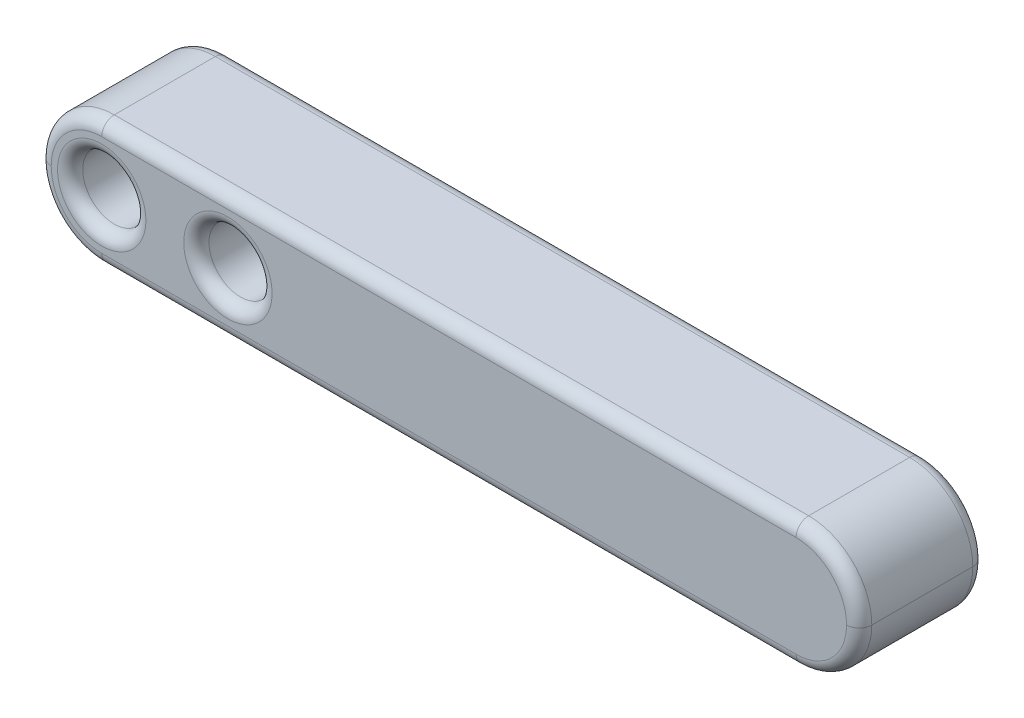
ISO-10303-21;
HEADER;
FILE_DESCRIPTION(('STEP AP214'),'2;1');
FILE_NAME('part.step','',(''),(''),'','','');
FILE_SCHEMA(('AUTOMOTIVE_DESIGN { 1 0 10303 214 1 1 1 1 }'));
ENDSEC;
DATA;
#1=APPLICATION_CONTEXT('core data for automotive mechanical design processes');
#2=APPLICATION_PROTOCOL_DEFINITION('international standard','automotive_design',2000,#1);
#3=PRODUCT_CONTEXT('',#1,'mechanical');
#4=PRODUCT('Part','Part','',(#3));
#5=PRODUCT_RELATED_PRODUCT_CATEGORY('part','',(#4));
#6=PRODUCT_DEFINITION_FORMATION('','',#4);
#7=PRODUCT_DEFINITION_CONTEXT('part definition',#1,'design');
#8=PRODUCT_DEFINITION('design','',#6,#7);
#9=PRODUCT_DEFINITION_SHAPE('','',#8);
#10=(LENGTH_UNIT() NAMED_UNIT(*) SI_UNIT(.MILLI.,.METRE.));
#11=(NAMED_UNIT(*) PLANE_ANGLE_UNIT() SI_UNIT($,.RADIAN.));
#12=(NAMED_UNIT(*) SI_UNIT($,.STERADIAN.) SOLID_ANGLE_UNIT());
#13=UNCERTAINTY_MEASURE_WITH_UNIT(LENGTH_MEASURE(1.E-05),#10,'distance_accuracy_value','');
#14=(GEOMETRIC_REPRESENTATION_CONTEXT(3) GLOBAL_UNCERTAINTY_ASSIGNED_CONTEXT((#13)) GLOBAL_UNIT_ASSIGNED_CONTEXT((#10,
#11,#12)) REPRESENTATION_CONTEXT('',''));
#15=CARTESIAN_POINT('',(0.,0.,0.));
#16=DIRECTION('',(0.,0.,1.));
#17=DIRECTION('',(1.,0.,0.));
#18=AXIS2_PLACEMENT_3D('',#15,#16,#17);
#19=CARTESIAN_POINT('',(0.,0.,10.));
#20=DIRECTION('',(0.,0.,-1.));
#21=DIRECTION('',(-1.,0.,0.));
#22=AXIS2_PLACEMENT_3D('',#19,#20,#21);
#23=PLANE('',#22);
#24=CARTESIAN_POINT('',(-17.5,0.,10.));
#25=DIRECTION('',(0.,0.,-1.));
#26=DIRECTION('',(-1.,0.,0.));
#27=AXIS2_PLACEMENT_3D('',#24,#25,#26);
#28=CIRCLE('',#27,3.5);
#29=CARTESIAN_POINT('',(-21.,0.,10.));
#30=VERTEX_POINT('',#29);
#31=EDGE_CURVE('E200',#30,#30,#28,.T.);
#32=ORIENTED_EDGE('',*,*,#31,.T.);
#33=EDGE_LOOP('',(#32));
#34=FACE_BOUND('',#33,.T.);
#35=CARTESIAN_POINT('',(-27.5,0.,10.));
#36=DIRECTION('',(0.,0.,-1.));
#37=DIRECTION('',(-1.,0.,0.));
#38=AXIS2_PLACEMENT_3D('',#35,#36,#37);
#39=CIRCLE('',#38,3.5);
#40=CARTESIAN_POINT('',(-31.,0.,10.));
#41=VERTEX_POINT('',#40);
#42=EDGE_CURVE('E197',#41,#41,#39,.T.);
#43=ORIENTED_EDGE('',*,*,#42,.T.);
#44=EDGE_LOOP('',(#43));
#45=FACE_BOUND('',#44,.T.);
#46=CARTESIAN_POINT('',(-27.5,0.,10.));
#47=DIRECTION('',(0.,0.,-1.));
#48=DIRECTION('',(-1.,0.,0.));
#49=AXIS2_PLACEMENT_3D('',#46,#47,#48);
#50=CIRCLE('',#49,4.);
#51=CARTESIAN_POINT('',(-27.5,4.,10.));
#52=VERTEX_POINT('',#51);
#53=CARTESIAN_POINT('',(-31.5,0.,10.));
#54=VERTEX_POINT('',#53);
#55=EDGE_CURVE('E193',#52,#54,#50,.F.);
#56=ORIENTED_EDGE('',*,*,#55,.T.);
#57=CARTESIAN_POINT('',(-27.5,0.,10.));
#58=DIRECTION('',(0.,0.,-1.));
#59=DIRECTION('',(-1.,0.,0.));
#60=AXIS2_PLACEMENT_3D('',#57,#58,#59);
#61=CIRCLE('',#60,4.);
#62=CARTESIAN_POINT('',(-27.5,-4.,10.));
#63=VERTEX_POINT('',#62);
#64=EDGE_CURVE('E195',#54,#63,#61,.F.);
#65=ORIENTED_EDGE('',*,*,#64,.T.);
#66=DIRECTION('',(1.,0.,0.));
#67=VECTOR('',#66,1.);
#68=CARTESIAN_POINT('',(0.,-4.,10.));
#69=LINE('',#68,#67);
#70=CARTESIAN_POINT('',(27.5,-4.,10.));
#71=VERTEX_POINT('',#70);
#72=EDGE_CURVE('E188',#63,#71,#69,.T.);
#73=ORIENTED_EDGE('',*,*,#72,.T.);
#74=CARTESIAN_POINT('',(27.5,0.,10.));
#75=DIRECTION('',(0.,0.,-1.));
#76=DIRECTION('',(-1.,0.,0.));
#77=AXIS2_PLACEMENT_3D('',#74,#75,#76);
#78=CIRCLE('',#77,4.);
#79=CARTESIAN_POINT('',(31.5,0.,10.));
#80=VERTEX_POINT('',#79);
#81=EDGE_CURVE('E184',#71,#80,#78,.F.);
#82=ORIENTED_EDGE('',*,*,#81,.T.);
#83=CARTESIAN_POINT('',(27.5,0.,10.));
#84=DIRECTION('',(0.,0.,-1.));
#85=DIRECTION('',(-1.,0.,0.));
#86=AXIS2_PLACEMENT_3D('',#83,#84,#85);
#87=CIRCLE('',#86,4.);
#88=CARTESIAN_POINT('',(27.5,4.,10.));
#89=VERTEX_POINT('',#88);
#90=EDGE_CURVE('E186',#80,#89,#87,.F.);
#91=ORIENTED_EDGE('',*,*,#90,.T.);
#92=DIRECTION('',(-1.,0.,0.));
#93=VECTOR('',#92,1.);
#94=CARTESIAN_POINT('',(0.,4.,10.));
#95=LINE('',#94,#93);
#96=EDGE_CURVE('E190',#89,#52,#95,.T.);
#97=ORIENTED_EDGE('',*,*,#96,.T.);
#98=EDGE_LOOP('',(#56,#65,#73,#82,#91,#97));
#99=FACE_BOUND('',#98,.T.);
#100=ADVANCED_FACE('F38',(#34,#45,#99),#23,.F.);
#101=CARTESIAN_POINT('',(0.,0.,0.));
#102=DIRECTION('',(0.,0.,-1.));
#103=DIRECTION('',(-1.,0.,0.));
#104=AXIS2_PLACEMENT_3D('',#101,#102,#103);
#105=PLANE('',#104);
#106=CARTESIAN_POINT('',(-17.5,0.,0.));
#107=DIRECTION('',(0.,0.,-1.));
#108=DIRECTION('',(-1.,0.,0.));
#109=AXIS2_PLACEMENT_3D('',#106,#107,#108);
#110=CIRCLE('',#109,3.5);
#111=CARTESIAN_POINT('',(-21.,0.,0.));
#112=VERTEX_POINT('',#111);
#113=EDGE_CURVE('E167',#112,#112,#110,.F.);
#114=ORIENTED_EDGE('',*,*,#113,.T.);
#115=EDGE_LOOP('',(#114));
#116=FACE_BOUND('',#115,.T.);
#117=CARTESIAN_POINT('',(-27.5,0.,0.));
#118=DIRECTION('',(0.,0.,-1.));
#119=DIRECTION('',(-1.,0.,0.));
#120=AXIS2_PLACEMENT_3D('',#117,#118,#119);
#121=CIRCLE('',#120,3.5);
#122=CARTESIAN_POINT('',(-31.,0.,0.));
#123=VERTEX_POINT('',#122);
#124=EDGE_CURVE('E164',#123,#123,#121,.F.);
#125=ORIENTED_EDGE('',*,*,#124,.T.);
#126=EDGE_LOOP('',(#125));
#127=FACE_BOUND('',#126,.T.);
#128=CARTESIAN_POINT('',(-27.5,0.,0.));
#129=DIRECTION('',(0.,0.,-1.));
#130=DIRECTION('',(-1.,0.,0.));
#131=AXIS2_PLACEMENT_3D('',#128,#129,#130);
#132=CIRCLE('',#131,4.);
#133=CARTESIAN_POINT('',(-27.5,-4.,0.));
#134=VERTEX_POINT('',#133);
#135=CARTESIAN_POINT('',(-31.5,0.,0.));
#136=VERTEX_POINT('',#135);
#137=EDGE_CURVE('E156',#134,#136,#132,.T.);
#138=ORIENTED_EDGE('',*,*,#137,.T.);
#139=CARTESIAN_POINT('',(-27.5,0.,0.));
#140=DIRECTION('',(0.,0.,-1.));
#141=DIRECTION('',(-1.,0.,0.));
#142=AXIS2_PLACEMENT_3D('',#139,#140,#141);
#143=CIRCLE('',#142,4.);
#144=CARTESIAN_POINT('',(-27.5,4.,0.));
#145=VERTEX_POINT('',#144);
#146=EDGE_CURVE('E162',#136,#145,#143,.T.);
#147=ORIENTED_EDGE('',*,*,#146,.T.);
#148=DIRECTION('',(-1.,0.,0.));
#149=VECTOR('',#148,1.);
#150=CARTESIAN_POINT('',(27.5,4.,0.));
#151=LINE('',#150,#149);
#152=CARTESIAN_POINT('',(27.5,4.,0.));
#153=VERTEX_POINT('',#152);
#154=EDGE_CURVE('E154',#145,#153,#151,.F.);
#155=ORIENTED_EDGE('',*,*,#154,.T.);
#156=CARTESIAN_POINT('',(27.5,0.,0.));
#157=DIRECTION('',(0.,0.,-1.));
#158=DIRECTION('',(-1.,0.,0.));
#159=AXIS2_PLACEMENT_3D('',#156,#157,#158);
#160=CIRCLE('',#159,4.);
#161=CARTESIAN_POINT('',(31.5,0.,0.));
#162=VERTEX_POINT('',#161);
#163=EDGE_CURVE('E135',#153,#162,#160,.T.);
#164=ORIENTED_EDGE('',*,*,#163,.T.);
#165=CARTESIAN_POINT('',(27.5,0.,0.));
#166=DIRECTION('',(0.,0.,-1.));
#167=DIRECTION('',(-1.,0.,0.));
#168=AXIS2_PLACEMENT_3D('',#165,#166,#167);
#169=CIRCLE('',#168,4.);
#170=CARTESIAN_POINT('',(27.5,-4.,0.));
#171=VERTEX_POINT('',#170);
#172=EDGE_CURVE('E143',#162,#171,#169,.T.);
#173=ORIENTED_EDGE('',*,*,#172,.T.);
#174=DIRECTION('',(1.,0.,0.));
#175=VECTOR('',#174,1.);
#176=CARTESIAN_POINT('',(-27.5,-4.,0.));
#177=LINE('',#176,#175);
#178=EDGE_CURVE('E149',#171,#134,#177,.F.);
#179=ORIENTED_EDGE('',*,*,#178,.T.);
#180=EDGE_LOOP('',(#138,#147,#155,#164,#173,#179));
#181=FACE_BOUND('',#180,.T.);
#182=ADVANCED_FACE('F152',(#116,#127,#181),#105,.T.);
#183=CARTESIAN_POINT('',(-32.5,5.,10.));
#184=DIRECTION('',(0.,-1.,0.));
#185=DIRECTION('',(0.,0.,-1.));
#186=AXIS2_PLACEMENT_3D('',#183,#184,#185);
#187=PLANE('',#186);
#188=DIRECTION('',(0.,0.,-1.));
#189=VECTOR('',#188,1.);
#190=CARTESIAN_POINT('',(27.5,5.,10.));
#191=LINE('',#190,#189);
#192=CARTESIAN_POINT('',(27.5,5.,9.));
#193=VERTEX_POINT('',#192);
#194=CARTESIAN_POINT('',(27.5,5.,0.999999999999999));
#195=VERTEX_POINT('',#194);
#196=EDGE_CURVE('E150',#193,#195,#191,.T.);
#197=ORIENTED_EDGE('',*,*,#196,.T.);
#198=DIRECTION('',(-1.,0.,0.));
#199=VECTOR('',#198,1.);
#200=CARTESIAN_POINT('',(-27.5,5.,0.999999999999999));
#201=LINE('',#200,#199);
#202=CARTESIAN_POINT('',(-27.5,5.,0.999999999999999));
#203=VERTEX_POINT('',#202);
#204=EDGE_CURVE('E176',#195,#203,#201,.T.);
#205=ORIENTED_EDGE('',*,*,#204,.T.);
#206=DIRECTION('',(0.,0.,-1.));
#207=VECTOR('',#206,1.);
#208=CARTESIAN_POINT('',(-27.5,5.,10.));
#209=LINE('',#208,#207);
#210=CARTESIAN_POINT('',(-27.5,5.,9.));
#211=VERTEX_POINT('',#210);
#212=EDGE_CURVE('E268',#203,#211,#209,.F.);
#213=ORIENTED_EDGE('',*,*,#212,.T.);
#214=DIRECTION('',(-1.,0.,0.));
#215=VECTOR('',#214,1.);
#216=CARTESIAN_POINT('',(-32.5,5.,9.));
#217=LINE('',#216,#215);
#218=EDGE_CURVE('E173',#211,#193,#217,.F.);
#219=ORIENTED_EDGE('',*,*,#218,.T.);
#220=EDGE_LOOP('',(#197,#205,#213,#219));
#221=FACE_BOUND('',#220,.T.);
#222=ADVANCED_FACE('F293',(#221),#187,.F.);
#223=CARTESIAN_POINT('',(-32.5,-5.,10.));
#224=DIRECTION('',(0.,1.,0.));
#225=DIRECTION('',(0.,0.,1.));
#226=AXIS2_PLACEMENT_3D('',#223,#224,#225);
#227=PLANE('',#226);
#228=DIRECTION('',(0.,0.,-1.));
#229=VECTOR('',#228,1.);
#230=CARTESIAN_POINT('',(-27.5,-5.,10.));
#231=LINE('',#230,#229);
#232=CARTESIAN_POINT('',(-27.5,-5.,9.));
#233=VERTEX_POINT('',#232);
#234=CARTESIAN_POINT('',(-27.5,-5.,0.999999999999999));
#235=VERTEX_POINT('',#234);
#236=EDGE_CURVE('E260',#233,#235,#231,.T.);
#237=ORIENTED_EDGE('',*,*,#236,.T.);
#238=DIRECTION('',(1.,0.,0.));
#239=VECTOR('',#238,1.);
#240=CARTESIAN_POINT('',(27.5,-5.,0.999999999999999));
#241=LINE('',#240,#239);
#242=CARTESIAN_POINT('',(27.5,-5.,0.999999999999999));
#243=VERTEX_POINT('',#242);
#244=EDGE_CURVE('E211',#235,#243,#241,.T.);
#245=ORIENTED_EDGE('',*,*,#244,.T.);
#246=DIRECTION('',(0.,0.,-1.));
#247=VECTOR('',#246,1.);
#248=CARTESIAN_POINT('',(27.5,-5.,10.));
#249=LINE('',#248,#247);
#250=CARTESIAN_POINT('',(27.5,-5.,9.));
#251=VERTEX_POINT('',#250);
#252=EDGE_CURVE('E263',#243,#251,#249,.F.);
#253=ORIENTED_EDGE('',*,*,#252,.T.);
#254=DIRECTION('',(1.,0.,0.));
#255=VECTOR('',#254,1.);
#256=CARTESIAN_POINT('',(-32.5,-5.,9.));
#257=LINE('',#256,#255);
#258=EDGE_CURVE('E209',#251,#233,#257,.F.);
#259=ORIENTED_EDGE('',*,*,#258,.T.);
#260=EDGE_LOOP('',(#237,#245,#253,#259));
#261=FACE_BOUND('',#260,.T.);
#262=ADVANCED_FACE('F259',(#261),#227,.F.);
#263=CARTESIAN_POINT('',(-27.5,0.,10.));
#264=DIRECTION('',(0.,0.,-1.));
#265=DIRECTION('',(-1.,0.,0.));
#266=AXIS2_PLACEMENT_3D('',#263,#264,#265);
#267=CYLINDRICAL_SURFACE('',#266,2.5);
#268=CARTESIAN_POINT('',(-27.5,0.,0.999999999999999));
#269=DIRECTION('',(0.,0.,-1.));
#270=DIRECTION('',(-1.,0.,0.));
#271=AXIS2_PLACEMENT_3D('',#268,#269,#270);
#272=CIRCLE('',#271,2.5);
#273=CARTESIAN_POINT('',(-30.,0.,0.999999999999999));
#274=VERTEX_POINT('',#273);
#275=EDGE_CURVE('E206',#274,#274,#272,.T.);
#276=ORIENTED_EDGE('',*,*,#275,.T.);
#277=EDGE_LOOP('',(#276));
#278=FACE_BOUND('',#277,.T.);
#279=CARTESIAN_POINT('',(-27.5,0.,9.));
#280=DIRECTION('',(0.,0.,-1.));
#281=DIRECTION('',(-1.,0.,0.));
#282=AXIS2_PLACEMENT_3D('',#279,#280,#281);
#283=CIRCLE('',#282,2.5);
#284=CARTESIAN_POINT('',(-30.,0.,9.));
#285=VERTEX_POINT('',#284);
#286=EDGE_CURVE('E203',#285,#285,#283,.F.);
#287=ORIENTED_EDGE('',*,*,#286,.T.);
#288=EDGE_LOOP('',(#287));
#289=FACE_BOUND('',#288,.T.);
#290=ADVANCED_FACE('F331',(#278,#289),#267,.F.);
#291=CARTESIAN_POINT('',(-17.5,0.,10.));
#292=DIRECTION('',(0.,0.,-1.));
#293=DIRECTION('',(-1.,0.,0.));
#294=AXIS2_PLACEMENT_3D('',#291,#292,#293);
#295=CYLINDRICAL_SURFACE('',#294,2.5);
#296=CARTESIAN_POINT('',(-17.5,0.,0.999999999999999));
#297=DIRECTION('',(0.,0.,-1.));
#298=DIRECTION('',(-1.,0.,0.));
#299=AXIS2_PLACEMENT_3D('',#296,#297,#298);
#300=CIRCLE('',#299,2.5);
#301=CARTESIAN_POINT('',(-20.,0.,0.999999999999999));
#302=VERTEX_POINT('',#301);
#303=EDGE_CURVE('E181',#302,#302,#300,.T.);
#304=ORIENTED_EDGE('',*,*,#303,.T.);
#305=EDGE_LOOP('',(#304));
#306=FACE_BOUND('',#305,.T.);
#307=CARTESIAN_POINT('',(-17.5,0.,9.));
#308=DIRECTION('',(0.,0.,-1.));
#309=DIRECTION('',(-1.,0.,0.));
#310=AXIS2_PLACEMENT_3D('',#307,#308,#309);
#311=CIRCLE('',#310,2.5);
#312=CARTESIAN_POINT('',(-20.,0.,9.));
#313=VERTEX_POINT('',#312);
#314=EDGE_CURVE('E178',#313,#313,#311,.F.);
#315=ORIENTED_EDGE('',*,*,#314,.T.);
#316=EDGE_LOOP('',(#315));
#317=FACE_BOUND('',#316,.T.);
#318=ADVANCED_FACE('F342',(#306,#317),#295,.F.);
#319=CARTESIAN_POINT('',(27.5,0.,10.));
#320=DIRECTION('',(0.,0.,-1.));
#321=DIRECTION('',(-1.,0.,0.));
#322=AXIS2_PLACEMENT_3D('',#319,#320,#321);
#323=CYLINDRICAL_SURFACE('',#322,5.);
#324=DIRECTION('',(0.,0.,-1.));
#325=VECTOR('',#324,1.);
#326=CARTESIAN_POINT('',(32.5,0.,10.));
#327=LINE('',#326,#325);
#328=CARTESIAN_POINT('',(32.5,0.,0.999999999999999));
#329=VERTEX_POINT('',#328);
#330=CARTESIAN_POINT('',(32.5,0.,9.));
#331=VERTEX_POINT('',#330);
#332=EDGE_CURVE('E266',#329,#331,#327,.F.);
#333=ORIENTED_EDGE('',*,*,#332,.F.);
#334=CARTESIAN_POINT('',(27.5,0.,0.999999999999999));
#335=DIRECTION('',(0.,0.,-1.));
#336=DIRECTION('',(-1.,0.,0.));
#337=AXIS2_PLACEMENT_3D('',#334,#335,#336);
#338=CIRCLE('',#337,5.);
#339=EDGE_CURVE('E137',#329,#195,#338,.F.);
#340=ORIENTED_EDGE('',*,*,#339,.T.);
#341=ORIENTED_EDGE('',*,*,#196,.F.);
#342=CARTESIAN_POINT('',(27.5,0.,9.));
#343=DIRECTION('',(0.,0.,-1.));
#344=DIRECTION('',(-1.,0.,0.));
#345=AXIS2_PLACEMENT_3D('',#342,#343,#344);
#346=CIRCLE('',#345,5.);
#347=EDGE_CURVE('E170',#193,#331,#346,.T.);
#348=ORIENTED_EDGE('',*,*,#347,.T.);
#349=EDGE_LOOP('',(#333,#340,#341,#348));
#350=FACE_BOUND('',#349,.T.);
#351=ADVANCED_FACE('F296',(#350),#323,.T.);
#352=CARTESIAN_POINT('',(27.5,0.,10.));
#353=DIRECTION('',(0.,0.,-1.));
#354=DIRECTION('',(-1.,0.,0.));
#355=AXIS2_PLACEMENT_3D('',#352,#353,#354);
#356=CYLINDRICAL_SURFACE('',#355,5.);
#357=ORIENTED_EDGE('',*,*,#252,.F.);
#358=CARTESIAN_POINT('',(27.5,0.,0.999999999999999));
#359=DIRECTION('',(0.,0.,-1.));
#360=DIRECTION('',(-1.,0.,0.));
#361=AXIS2_PLACEMENT_3D('',#358,#359,#360);
#362=CIRCLE('',#361,5.);
#363=EDGE_CURVE('E11',#243,#329,#362,.F.);
#364=ORIENTED_EDGE('',*,*,#363,.T.);
#365=ORIENTED_EDGE('',*,*,#332,.T.);
#366=CARTESIAN_POINT('',(27.5,0.,9.));
#367=DIRECTION('',(0.,0.,-1.));
#368=DIRECTION('',(-1.,0.,0.));
#369=AXIS2_PLACEMENT_3D('',#366,#367,#368);
#370=CIRCLE('',#369,5.);
#371=EDGE_CURVE('E47',#331,#251,#370,.T.);
#372=ORIENTED_EDGE('',*,*,#371,.T.);
#373=EDGE_LOOP('',(#357,#364,#365,#372));
#374=FACE_BOUND('',#373,.T.);
#375=ADVANCED_FACE('F298',(#374),#356,.T.);
#376=CARTESIAN_POINT('',(-27.5,0.,10.));
#377=DIRECTION('',(0.,0.,-1.));
#378=DIRECTION('',(-1.,0.,0.));
#379=AXIS2_PLACEMENT_3D('',#376,#377,#378);
#380=CYLINDRICAL_SURFACE('',#379,5.);
#381=DIRECTION('',(0.,0.,-1.));
#382=VECTOR('',#381,1.);
#383=CARTESIAN_POINT('',(-32.5,0.,10.));
#384=LINE('',#383,#382);
#385=CARTESIAN_POINT('',(-32.5,0.,0.999999999999999));
#386=VERTEX_POINT('',#385);
#387=CARTESIAN_POINT('',(-32.5,0.,9.));
#388=VERTEX_POINT('',#387);
#389=EDGE_CURVE('E231',#386,#388,#384,.F.);
#390=ORIENTED_EDGE('',*,*,#389,.F.);
#391=CARTESIAN_POINT('',(-27.5,0.,0.999999999999999));
#392=DIRECTION('',(0.,0.,-1.));
#393=DIRECTION('',(-1.,0.,0.));
#394=AXIS2_PLACEMENT_3D('',#391,#392,#393);
#395=CIRCLE('',#394,5.);
#396=EDGE_CURVE('E214',#386,#235,#395,.F.);
#397=ORIENTED_EDGE('',*,*,#396,.T.);
#398=ORIENTED_EDGE('',*,*,#236,.F.);
#399=CARTESIAN_POINT('',(-27.5,0.,9.));
#400=DIRECTION('',(0.,0.,-1.));
#401=DIRECTION('',(-1.,0.,0.));
#402=AXIS2_PLACEMENT_3D('',#399,#400,#401);
#403=CIRCLE('',#402,5.);
#404=EDGE_CURVE('E55',#233,#388,#403,.T.);
#405=ORIENTED_EDGE('',*,*,#404,.T.);
#406=EDGE_LOOP('',(#390,#397,#398,#405));
#407=FACE_BOUND('',#406,.T.);
#408=ADVANCED_FACE('F264',(#407),#380,.T.);
#409=CARTESIAN_POINT('',(-27.5,0.,10.));
#410=DIRECTION('',(0.,0.,-1.));
#411=DIRECTION('',(-1.,0.,0.));
#412=AXIS2_PLACEMENT_3D('',#409,#410,#411);
#413=CYLINDRICAL_SURFACE('',#412,5.);
#414=ORIENTED_EDGE('',*,*,#212,.F.);
#415=CARTESIAN_POINT('',(-27.5,0.,0.999999999999999));
#416=DIRECTION('',(0.,0.,-1.));
#417=DIRECTION('',(-1.,0.,0.));
#418=AXIS2_PLACEMENT_3D('',#415,#416,#417);
#419=CIRCLE('',#418,5.);
#420=EDGE_CURVE('E62',#203,#386,#419,.F.);
#421=ORIENTED_EDGE('',*,*,#420,.T.);
#422=ORIENTED_EDGE('',*,*,#389,.T.);
#423=CARTESIAN_POINT('',(-27.5,0.,9.));
#424=DIRECTION('',(0.,0.,-1.));
#425=DIRECTION('',(-1.,0.,0.));
#426=AXIS2_PLACEMENT_3D('',#423,#424,#425);
#427=CIRCLE('',#426,5.);
#428=EDGE_CURVE('E216',#388,#211,#427,.T.);
#429=ORIENTED_EDGE('',*,*,#428,.T.);
#430=EDGE_LOOP('',(#414,#421,#422,#429));
#431=FACE_BOUND('',#430,.T.);
#432=ADVANCED_FACE('F278',(#431),#413,.T.);
#433=CARTESIAN_POINT('',(-27.5,0.,0.999999999999999));
#434=DIRECTION('',(0.,0.,-1.));
#435=DIRECTION('',(-1.,0.,0.));
#436=AXIS2_PLACEMENT_3D('',#433,#434,#435);
#437=TOROIDAL_SURFACE('',#436,4.,1.);
#438=CARTESIAN_POINT('',(-27.5,-4.,0.999999999999999));
#439=DIRECTION('',(1.,0.,0.));
#440=DIRECTION('',(0.,0.,-1.));
#441=AXIS2_PLACEMENT_3D('',#438,#439,#440);
#442=CIRCLE('',#441,1.);
#443=EDGE_CURVE('E225',#235,#134,#442,.T.);
#444=ORIENTED_EDGE('',*,*,#443,.F.);
#445=ORIENTED_EDGE('',*,*,#396,.F.);
#446=CARTESIAN_POINT('',(-31.5,0.,1.));
#447=DIRECTION('',(0.,1.,0.));
#448=DIRECTION('',(0.,0.,1.));
#449=AXIS2_PLACEMENT_3D('',#446,#447,#448);
#450=CIRCLE('',#449,1.);
#451=EDGE_CURVE('E228',#136,#386,#450,.T.);
#452=ORIENTED_EDGE('',*,*,#451,.F.);
#453=ORIENTED_EDGE('',*,*,#137,.F.);
#454=EDGE_LOOP('',(#444,#445,#452,#453));
#455=FACE_BOUND('',#454,.T.);
#456=ADVANCED_FACE('F305',(#455),#437,.T.);
#457=CARTESIAN_POINT('',(-27.5,0.,0.999999999999999));
#458=DIRECTION('',(0.,0.,-1.));
#459=DIRECTION('',(-1.,0.,0.));
#460=AXIS2_PLACEMENT_3D('',#457,#458,#459);
#461=TOROIDAL_SURFACE('',#460,4.,1.);
#462=ORIENTED_EDGE('',*,*,#451,.T.);
#463=ORIENTED_EDGE('',*,*,#420,.F.);
#464=CARTESIAN_POINT('',(-27.5,4.,1.));
#465=DIRECTION('',(1.,0.,0.));
#466=DIRECTION('',(0.,0.,-1.));
#467=AXIS2_PLACEMENT_3D('',#464,#465,#466);
#468=CIRCLE('',#467,1.);
#469=EDGE_CURVE('E222',#145,#203,#468,.T.);
#470=ORIENTED_EDGE('',*,*,#469,.F.);
#471=ORIENTED_EDGE('',*,*,#146,.F.);
#472=EDGE_LOOP('',(#462,#463,#470,#471));
#473=FACE_BOUND('',#472,.T.);
#474=ADVANCED_FACE('F309',(#473),#461,.T.);
#475=CARTESIAN_POINT('',(-32.5,-4.,0.999999999999999));
#476=DIRECTION('',(-1.,0.,0.));
#477=DIRECTION('',(0.,0.,1.));
#478=AXIS2_PLACEMENT_3D('',#475,#476,#477);
#479=CYLINDRICAL_SURFACE('',#478,1.);
#480=ORIENTED_EDGE('',*,*,#443,.T.);
#481=ORIENTED_EDGE('',*,*,#178,.F.);
#482=CARTESIAN_POINT('',(27.5,-4.,0.999999999999999));
#483=DIRECTION('',(1.,0.,0.));
#484=DIRECTION('',(0.,0.,-1.));
#485=AXIS2_PLACEMENT_3D('',#482,#483,#484);
#486=CIRCLE('',#485,1.);
#487=EDGE_CURVE('E146',#243,#171,#486,.T.);
#488=ORIENTED_EDGE('',*,*,#487,.F.);
#489=ORIENTED_EDGE('',*,*,#244,.F.);
#490=EDGE_LOOP('',(#480,#481,#488,#489));
#491=FACE_BOUND('',#490,.T.);
#492=ADVANCED_FACE('F301',(#491),#479,.T.);
#493=CARTESIAN_POINT('',(-32.5,4.,0.999999999999999));
#494=DIRECTION('',(1.,0.,0.));
#495=DIRECTION('',(0.,0.,-1.));
#496=AXIS2_PLACEMENT_3D('',#493,#494,#495);
#497=CYLINDRICAL_SURFACE('',#496,1.);
#498=ORIENTED_EDGE('',*,*,#469,.T.);
#499=ORIENTED_EDGE('',*,*,#204,.F.);
#500=CARTESIAN_POINT('',(27.5,4.,1.));
#501=DIRECTION('',(1.,0.,0.));
#502=DIRECTION('',(0.,0.,-1.));
#503=AXIS2_PLACEMENT_3D('',#500,#501,#502);
#504=CIRCLE('',#503,1.);
#505=EDGE_CURVE('E140',#153,#195,#504,.T.);
#506=ORIENTED_EDGE('',*,*,#505,.F.);
#507=ORIENTED_EDGE('',*,*,#154,.F.);
#508=EDGE_LOOP('',(#498,#499,#506,#507));
#509=FACE_BOUND('',#508,.T.);
#510=ADVANCED_FACE('F312',(#509),#497,.T.);
#511=CARTESIAN_POINT('',(27.5,0.,0.999999999999999));
#512=DIRECTION('',(0.,0.,-1.));
#513=DIRECTION('',(-1.,0.,0.));
#514=AXIS2_PLACEMENT_3D('',#511,#512,#513);
#515=TOROIDAL_SURFACE('',#514,4.,1.);
#516=ORIENTED_EDGE('',*,*,#487,.T.);
#517=ORIENTED_EDGE('',*,*,#172,.F.);
#518=CARTESIAN_POINT('',(31.5,0.,0.999999999999999));
#519=DIRECTION('',(0.,1.,0.));
#520=DIRECTION('',(0.,0.,1.));
#521=AXIS2_PLACEMENT_3D('',#518,#519,#520);
#522=CIRCLE('',#521,1.);
#523=EDGE_CURVE('E131',#329,#162,#522,.T.);
#524=ORIENTED_EDGE('',*,*,#523,.F.);
#525=ORIENTED_EDGE('',*,*,#363,.F.);
#526=EDGE_LOOP('',(#516,#517,#524,#525));
#527=FACE_BOUND('',#526,.T.);
#528=ADVANCED_FACE('F144',(#527),#515,.T.);
#529=CARTESIAN_POINT('',(27.5,0.,0.999999999999999));
#530=DIRECTION('',(0.,0.,-1.));
#531=DIRECTION('',(-1.,0.,0.));
#532=AXIS2_PLACEMENT_3D('',#529,#530,#531);
#533=TOROIDAL_SURFACE('',#532,4.,1.);
#534=ORIENTED_EDGE('',*,*,#505,.T.);
#535=ORIENTED_EDGE('',*,*,#339,.F.);
#536=ORIENTED_EDGE('',*,*,#523,.T.);
#537=ORIENTED_EDGE('',*,*,#163,.F.);
#538=EDGE_LOOP('',(#534,#535,#536,#537));
#539=FACE_BOUND('',#538,.T.);
#540=ADVANCED_FACE('F133',(#539),#533,.T.);
#541=CARTESIAN_POINT('',(-17.5,0.,0.999999999999999));
#542=DIRECTION('',(0.,0.,-1.));
#543=DIRECTION('',(-1.,0.,0.));
#544=AXIS2_PLACEMENT_3D('',#541,#542,#543);
#545=TOROIDAL_SURFACE('',#544,3.5,1.);
#546=ORIENTED_EDGE('',*,*,#303,.F.);
#547=EDGE_LOOP('',(#546));
#548=FACE_BOUND('',#547,.T.);
#549=ORIENTED_EDGE('',*,*,#113,.F.);
#550=EDGE_LOOP('',(#549));
#551=FACE_BOUND('',#550,.T.);
#552=ADVANCED_FACE('F348',(#548,#551),#545,.T.);
#553=CARTESIAN_POINT('',(-17.5,0.,9.));
#554=DIRECTION('',(0.,0.,-1.));
#555=DIRECTION('',(-1.,0.,0.));
#556=AXIS2_PLACEMENT_3D('',#553,#554,#555);
#557=TOROIDAL_SURFACE('',#556,3.5,1.);
#558=ORIENTED_EDGE('',*,*,#31,.F.);
#559=EDGE_LOOP('',(#558));
#560=FACE_BOUND('',#559,.T.);
#561=ORIENTED_EDGE('',*,*,#314,.F.);
#562=EDGE_LOOP('',(#561));
#563=FACE_BOUND('',#562,.T.);
#564=ADVANCED_FACE('F352',(#560,#563),#557,.T.);
#565=CARTESIAN_POINT('',(-27.5,0.,0.999999999999999));
#566=DIRECTION('',(0.,0.,-1.));
#567=DIRECTION('',(-1.,0.,0.));
#568=AXIS2_PLACEMENT_3D('',#565,#566,#567);
#569=TOROIDAL_SURFACE('',#568,3.5,1.);
#570=ORIENTED_EDGE('',*,*,#275,.F.);
#571=EDGE_LOOP('',(#570));
#572=FACE_BOUND('',#571,.T.);
#573=ORIENTED_EDGE('',*,*,#124,.F.);
#574=EDGE_LOOP('',(#573));
#575=FACE_BOUND('',#574,.T.);
#576=ADVANCED_FACE('F358',(#572,#575),#569,.T.);
#577=CARTESIAN_POINT('',(-27.5,0.,9.));
#578=DIRECTION('',(0.,0.,-1.));
#579=DIRECTION('',(-1.,0.,0.));
#580=AXIS2_PLACEMENT_3D('',#577,#578,#579);
#581=TOROIDAL_SURFACE('',#580,3.5,1.);
#582=ORIENTED_EDGE('',*,*,#42,.F.);
#583=EDGE_LOOP('',(#582));
#584=FACE_BOUND('',#583,.T.);
#585=ORIENTED_EDGE('',*,*,#286,.F.);
#586=EDGE_LOOP('',(#585));
#587=FACE_BOUND('',#586,.T.);
#588=ADVANCED_FACE('F368',(#584,#587),#581,.T.);
#589=CARTESIAN_POINT('',(0.,-4.,9.));
#590=DIRECTION('',(1.,0.,0.));
#591=DIRECTION('',(0.,0.,-1.));
#592=AXIS2_PLACEMENT_3D('',#589,#590,#591);
#593=CYLINDRICAL_SURFACE('',#592,1.);
#594=CARTESIAN_POINT('',(-27.5,-4.,9.));
#595=DIRECTION('',(-1.,0.,0.));
#596=DIRECTION('',(0.,0.,1.));
#597=AXIS2_PLACEMENT_3D('',#594,#595,#596);
#598=CIRCLE('',#597,1.);
#599=EDGE_CURVE('E241',#233,#63,#598,.T.);
#600=ORIENTED_EDGE('',*,*,#599,.F.);
#601=ORIENTED_EDGE('',*,*,#258,.F.);
#602=CARTESIAN_POINT('',(27.5,-4.,9.));
#603=DIRECTION('',(1.,0.,0.));
#604=DIRECTION('',(0.,0.,-1.));
#605=AXIS2_PLACEMENT_3D('',#602,#603,#604);
#606=CIRCLE('',#605,1.);
#607=EDGE_CURVE('E42',#71,#251,#606,.T.);
#608=ORIENTED_EDGE('',*,*,#607,.F.);
#609=ORIENTED_EDGE('',*,*,#72,.F.);
#610=EDGE_LOOP('',(#600,#601,#608,#609));
#611=FACE_BOUND('',#610,.T.);
#612=ADVANCED_FACE('F40',(#611),#593,.T.);
#613=CARTESIAN_POINT('',(27.5,0.,9.));
#614=DIRECTION('',(0.,0.,-1.));
#615=DIRECTION('',(-1.,0.,0.));
#616=AXIS2_PLACEMENT_3D('',#613,#614,#615);
#617=TOROIDAL_SURFACE('',#616,4.,1.);
#618=ORIENTED_EDGE('',*,*,#607,.T.);
#619=ORIENTED_EDGE('',*,*,#371,.F.);
#620=CARTESIAN_POINT('',(31.5,0.,9.));
#621=DIRECTION('',(0.,1.,0.));
#622=DIRECTION('',(0.,0.,1.));
#623=AXIS2_PLACEMENT_3D('',#620,#621,#622);
#624=CIRCLE('',#623,1.);
#625=EDGE_CURVE('E239',#80,#331,#624,.T.);
#626=ORIENTED_EDGE('',*,*,#625,.F.);
#627=ORIENTED_EDGE('',*,*,#81,.F.);
#628=EDGE_LOOP('',(#618,#619,#626,#627));
#629=FACE_BOUND('',#628,.T.);
#630=ADVANCED_FACE('F251',(#629),#617,.T.);
#631=CARTESIAN_POINT('',(-27.5,0.,9.));
#632=DIRECTION('',(0.,0.,-1.));
#633=DIRECTION('',(-1.,0.,0.));
#634=AXIS2_PLACEMENT_3D('',#631,#632,#633);
#635=TOROIDAL_SURFACE('',#634,4.,1.);
#636=ORIENTED_EDGE('',*,*,#599,.T.);
#637=ORIENTED_EDGE('',*,*,#64,.F.);
#638=CARTESIAN_POINT('',(-31.5,0.,9.));
#639=DIRECTION('',(0.,1.,0.));
#640=DIRECTION('',(0.,0.,1.));
#641=AXIS2_PLACEMENT_3D('',#638,#639,#640);
#642=CIRCLE('',#641,1.);
#643=EDGE_CURVE('E236',#388,#54,#642,.T.);
#644=ORIENTED_EDGE('',*,*,#643,.F.);
#645=ORIENTED_EDGE('',*,*,#404,.F.);
#646=EDGE_LOOP('',(#636,#637,#644,#645));
#647=FACE_BOUND('',#646,.T.);
#648=ADVANCED_FACE('F280',(#647),#635,.T.);
#649=CARTESIAN_POINT('',(27.5,0.,9.));
#650=DIRECTION('',(0.,0.,-1.));
#651=DIRECTION('',(-1.,0.,0.));
#652=AXIS2_PLACEMENT_3D('',#649,#650,#651);
#653=TOROIDAL_SURFACE('',#652,4.,1.);
#654=ORIENTED_EDGE('',*,*,#625,.T.);
#655=ORIENTED_EDGE('',*,*,#347,.F.);
#656=CARTESIAN_POINT('',(27.5,4.,9.));
#657=DIRECTION('',(-1.,0.,0.));
#658=DIRECTION('',(0.,0.,1.));
#659=AXIS2_PLACEMENT_3D('',#656,#657,#658);
#660=CIRCLE('',#659,1.);
#661=EDGE_CURVE('E234',#89,#193,#660,.T.);
#662=ORIENTED_EDGE('',*,*,#661,.F.);
#663=ORIENTED_EDGE('',*,*,#90,.F.);
#664=EDGE_LOOP('',(#654,#655,#662,#663));
#665=FACE_BOUND('',#664,.T.);
#666=ADVANCED_FACE('F377',(#665),#653,.T.);
#667=CARTESIAN_POINT('',(-27.5,0.,9.));
#668=DIRECTION('',(0.,0.,-1.));
#669=DIRECTION('',(-1.,0.,0.));
#670=AXIS2_PLACEMENT_3D('',#667,#668,#669);
#671=TOROIDAL_SURFACE('',#670,4.,1.);
#672=ORIENTED_EDGE('',*,*,#643,.T.);
#673=ORIENTED_EDGE('',*,*,#55,.F.);
#674=CARTESIAN_POINT('',(-27.5,4.,9.));
#675=DIRECTION('',(1.,0.,0.));
#676=DIRECTION('',(0.,0.,-1.));
#677=AXIS2_PLACEMENT_3D('',#674,#675,#676);
#678=CIRCLE('',#677,1.);
#679=EDGE_CURVE('E232',#211,#52,#678,.T.);
#680=ORIENTED_EDGE('',*,*,#679,.F.);
#681=ORIENTED_EDGE('',*,*,#428,.F.);
#682=EDGE_LOOP('',(#672,#673,#680,#681));
#683=FACE_BOUND('',#682,.T.);
#684=ADVANCED_FACE('F284',(#683),#671,.T.);
#685=CARTESIAN_POINT('',(0.,4.,9.));
#686=DIRECTION('',(-1.,0.,0.));
#687=DIRECTION('',(0.,0.,1.));
#688=AXIS2_PLACEMENT_3D('',#685,#686,#687);
#689=CYLINDRICAL_SURFACE('',#688,1.);
#690=ORIENTED_EDGE('',*,*,#661,.T.);
#691=ORIENTED_EDGE('',*,*,#218,.F.);
#692=ORIENTED_EDGE('',*,*,#679,.T.);
#693=ORIENTED_EDGE('',*,*,#96,.F.);
#694=EDGE_LOOP('',(#690,#691,#692,#693));
#695=FACE_BOUND('',#694,.T.);
#696=ADVANCED_FACE('F288',(#695),#689,.T.);
#697=CLOSED_SHELL('',(#100,#182,#222,#262,#290,#318,#351,#375,#408,#432,#456,#474,#492,#510,
#528,#540,#552,#564,#576,#588,#612,#630,#648,#666,#684,#696));
#698=MANIFOLD_SOLID_BREP('B2',#697);
#699=ADVANCED_BREP_SHAPE_REPRESENTATION('',(#18,#698),#14);
#700=SHAPE_DEFINITION_REPRESENTATION(#9,#699);
ENDSEC;
END-ISO-10303-21;
